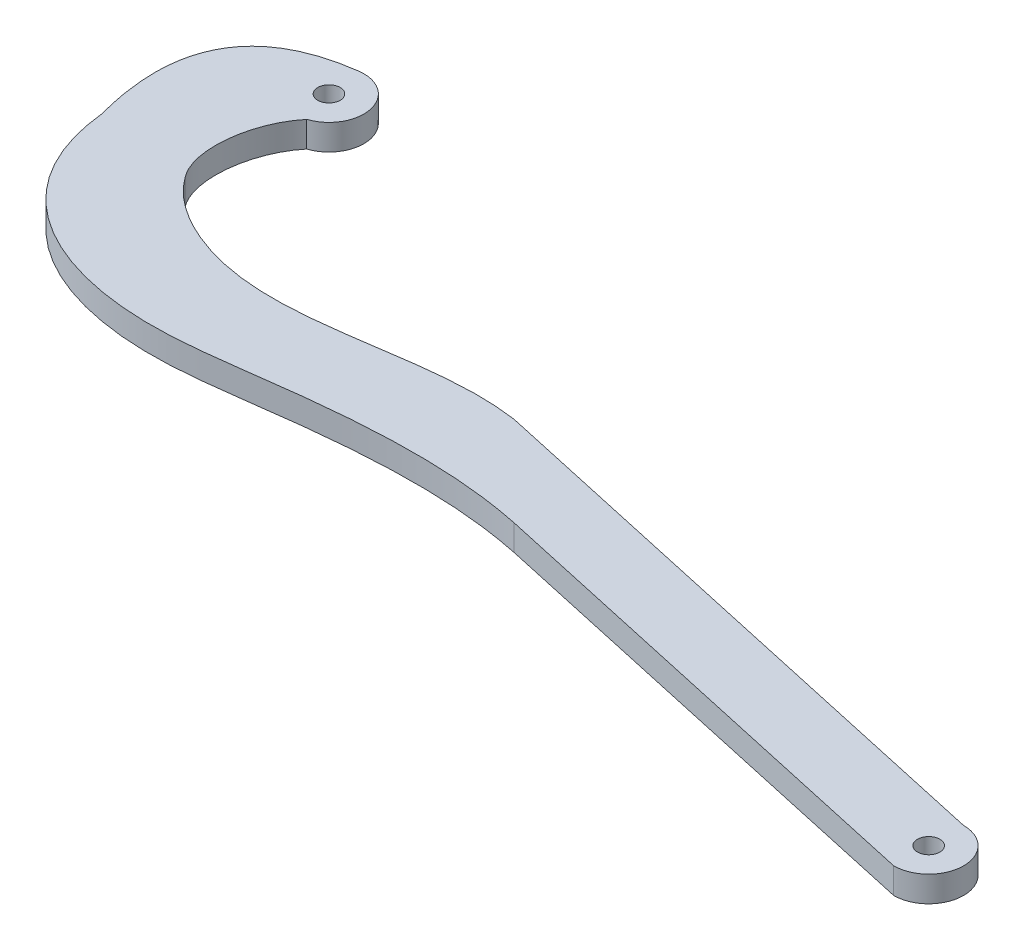
ISO-10303-21;
HEADER;
FILE_DESCRIPTION(('STEP AP214'),'2;1');
FILE_NAME('part.step','',(''),(''),'','','');
FILE_SCHEMA(('AUTOMOTIVE_DESIGN { 1 0 10303 214 1 1 1 1 }'));
ENDSEC;
DATA;
#1=APPLICATION_CONTEXT('core data for automotive mechanical design processes');
#2=APPLICATION_PROTOCOL_DEFINITION('international standard','automotive_design',2000,#1);
#3=PRODUCT_CONTEXT('',#1,'mechanical');
#4=PRODUCT('Part','Part','',(#3));
#5=PRODUCT_RELATED_PRODUCT_CATEGORY('part','',(#4));
#6=PRODUCT_DEFINITION_FORMATION('','',#4);
#7=PRODUCT_DEFINITION_CONTEXT('part definition',#1,'design');
#8=PRODUCT_DEFINITION('design','',#6,#7);
#9=PRODUCT_DEFINITION_SHAPE('','',#8);
#10=(LENGTH_UNIT() NAMED_UNIT(*) SI_UNIT(.MILLI.,.METRE.));
#11=(NAMED_UNIT(*) PLANE_ANGLE_UNIT() SI_UNIT($,.RADIAN.));
#12=(NAMED_UNIT(*) SI_UNIT($,.STERADIAN.) SOLID_ANGLE_UNIT());
#13=UNCERTAINTY_MEASURE_WITH_UNIT(LENGTH_MEASURE(1.E-05),#10,'distance_accuracy_value','');
#14=(GEOMETRIC_REPRESENTATION_CONTEXT(3) GLOBAL_UNCERTAINTY_ASSIGNED_CONTEXT((#13)) GLOBAL_UNIT_ASSIGNED_CONTEXT((#10,
#11,#12)) REPRESENTATION_CONTEXT('',''));
#15=CARTESIAN_POINT('',(0.,0.,0.));
#16=DIRECTION('',(0.,0.,1.));
#17=DIRECTION('',(1.,0.,0.));
#18=AXIS2_PLACEMENT_3D('',#15,#16,#17);
#19=CARTESIAN_POINT('',(0.,5.842,0.));
#20=DIRECTION('',(0.,-1.,0.));
#21=DIRECTION('',(0.,0.,-1.));
#22=AXIS2_PLACEMENT_3D('',#19,#20,#21);
#23=CYLINDRICAL_SURFACE('',#22,7.9375);
#24=CARTESIAN_POINT('',(0.,0.,0.));
#25=DIRECTION('',(0.,1.,0.));
#26=DIRECTION('',(0.,0.,1.));
#27=AXIS2_PLACEMENT_3D('',#24,#25,#26);
#28=CIRCLE('',#27,7.9375);
#29=CARTESIAN_POINT('',(2.49064355468781,0.,7.53661734025896));
#30=VERTEX_POINT('',#29);
#31=CARTESIAN_POINT('',(-0.961636053544628,0.,-7.87903308474606));
#32=VERTEX_POINT('',#31);
#33=EDGE_CURVE('E205',#30,#32,#28,.T.);
#34=ORIENTED_EDGE('',*,*,#33,.T.);
#35=DIRECTION('',(0.,-1.,0.));
#36=VECTOR('',#35,1.);
#37=CARTESIAN_POINT('',(-0.961636053544628,5.842,-7.87903308474606));
#38=LINE('',#37,#36);
#39=CARTESIAN_POINT('',(-0.961636053544628,5.842,-7.87903308474606));
#40=VERTEX_POINT('',#39);
#41=EDGE_CURVE('E11',#40,#32,#38,.T.);
#42=ORIENTED_EDGE('',*,*,#41,.F.);
#43=CARTESIAN_POINT('',(0.,5.842,0.));
#44=DIRECTION('',(0.,1.,0.));
#45=DIRECTION('',(0.,0.,1.));
#46=AXIS2_PLACEMENT_3D('',#43,#44,#45);
#47=CIRCLE('',#46,7.9375);
#48=CARTESIAN_POINT('',(2.49064355468781,5.842,7.53661734025896));
#49=VERTEX_POINT('',#48);
#50=EDGE_CURVE('E239',#49,#40,#47,.T.);
#51=ORIENTED_EDGE('',*,*,#50,.F.);
#52=DIRECTION('',(0.,-1.,0.));
#53=VECTOR('',#52,1.);
#54=CARTESIAN_POINT('',(2.49064355468781,5.842,7.53661734025896));
#55=LINE('',#54,#53);
#56=EDGE_CURVE('E52',#49,#30,#55,.T.);
#57=ORIENTED_EDGE('',*,*,#56,.T.);
#58=EDGE_LOOP('',(#34,#42,#51,#57));
#59=FACE_BOUND('',#58,.T.);
#60=ADVANCED_FACE('F36',(#59),#23,.T.);
#61=CARTESIAN_POINT('',(-0.96163605354463,5.842,-7.87903308474607));
#62=CARTESIAN_POINT('',(-30.9985165462745,5.842,-4.01650988273508));
#63=CARTESIAN_POINT('',(-21.8783564093828,5.842,29.6751276414794));
#64=B_SPLINE_CURVE_WITH_KNOTS('',2,(#61,#62,#63),.UNSPECIFIED.,.F.,.F.,(3,3),(0.,
0.35527502732888),.UNSPECIFIED.);
#65=DIRECTION('',(0.,-1.,0.));
#66=VECTOR('',#65,1.);
#67=SURFACE_OF_LINEAR_EXTRUSION('',#64,#66);
#68=CARTESIAN_POINT('',(-0.96163605354463,0.,-7.87903308474607));
#69=CARTESIAN_POINT('',(-30.9985165462745,0.,-4.01650988273508));
#70=CARTESIAN_POINT('',(-21.8783564093828,0.,29.6751276414794));
#71=B_SPLINE_CURVE_WITH_KNOTS('',2,(#68,#69,#70),.UNSPECIFIED.,.F.,.F.,(3,3),(0.,
0.35527502732888),.UNSPECIFIED.);
#72=CARTESIAN_POINT('',(-21.8783564093828,0.,29.6751276414794));
#73=VERTEX_POINT('',#72);
#74=EDGE_CURVE('E202',#32,#73,#71,.T.);
#75=ORIENTED_EDGE('',*,*,#74,.T.);
#76=DIRECTION('',(0.,-1.,0.));
#77=VECTOR('',#76,1.);
#78=CARTESIAN_POINT('',(-21.8783564093828,5.842,29.6751276414794));
#79=LINE('',#78,#77);
#80=CARTESIAN_POINT('',(-21.8783564093828,5.842,29.6751276414794));
#81=VERTEX_POINT('',#80);
#82=EDGE_CURVE('E44',#81,#73,#79,.T.);
#83=ORIENTED_EDGE('',*,*,#82,.F.);
#84=EDGE_CURVE('E90',#40,#81,#64,.T.);
#85=ORIENTED_EDGE('',*,*,#84,.F.);
#86=ORIENTED_EDGE('',*,*,#41,.T.);
#87=EDGE_LOOP('',(#75,#83,#85,#86));
#88=FACE_BOUND('',#87,.T.);
#89=ADVANCED_FACE('F164',(#88),#67,.F.);
#90=CARTESIAN_POINT('',(-21.8783564093828,5.842,29.6751276414794));
#91=CARTESIAN_POINT('',(-19.1757089829597,5.842,55.8612041472436));
#92=CARTESIAN_POINT('',(11.6989839676944,5.842,69.0974176284351));
#93=CARTESIAN_POINT('',(59.1950530478991,5.842,61.6130832527183));
#94=CARTESIAN_POINT('',(86.7060869899994,5.842,59.4299802769365));
#95=CARTESIAN_POINT('',(105.423206443273,5.842,63.3548489846126));
#96=B_SPLINE_CURVE_WITH_KNOTS('',3,(#90,#91,#92,#93,#94,#95),.UNSPECIFIED.,.F.,.F.,(4,1,1,4),
(0.,0.428303152813211,0.609288088126055,1.),.UNSPECIFIED.);
#97=DIRECTION('',(0.,-1.,0.));
#98=VECTOR('',#97,1.);
#99=SURFACE_OF_LINEAR_EXTRUSION('',#96,#98);
#100=CARTESIAN_POINT('',(-21.8783564093828,0.,29.6751276414794));
#101=CARTESIAN_POINT('',(-19.1757089829597,0.,55.8612041472436));
#102=CARTESIAN_POINT('',(11.6989839676944,0.,69.0974176284351));
#103=CARTESIAN_POINT('',(59.1950530478991,0.,61.6130832527183));
#104=CARTESIAN_POINT('',(86.7060869899994,0.,59.4299802769365));
#105=CARTESIAN_POINT('',(105.423206443273,0.,63.3548489846126));
#106=B_SPLINE_CURVE_WITH_KNOTS('',3,(#100,#101,#102,#103,#104,#105),.UNSPECIFIED.,.F.,.F.,(4,1,
1,4),(0.,0.428303152813211,0.609288088126055,1.),.UNSPECIFIED.);
#107=CARTESIAN_POINT('',(105.423206443273,0.,63.3548489846126));
#108=VERTEX_POINT('',#107);
#109=EDGE_CURVE('E198',#73,#108,#106,.T.);
#110=ORIENTED_EDGE('',*,*,#109,.T.);
#111=DIRECTION('',(0.,-1.,0.));
#112=VECTOR('',#111,1.);
#113=CARTESIAN_POINT('',(105.423206443273,5.842,63.3548489846126));
#114=LINE('',#113,#112);
#115=CARTESIAN_POINT('',(105.423206443273,5.842,63.3548489846126));
#116=VERTEX_POINT('',#115);
#117=EDGE_CURVE('E190',#116,#108,#114,.T.);
#118=ORIENTED_EDGE('',*,*,#117,.F.);
#119=EDGE_CURVE('E167',#81,#116,#96,.T.);
#120=ORIENTED_EDGE('',*,*,#119,.F.);
#121=ORIENTED_EDGE('',*,*,#82,.T.);
#122=EDGE_LOOP('',(#110,#118,#120,#121));
#123=FACE_BOUND('',#122,.T.);
#124=ADVANCED_FACE('F160',(#123),#99,.F.);
#125=CARTESIAN_POINT('',(-8.43114589308616,5.842,38.2756490531321));
#126=DIRECTION('',(0.215117386265898,0.,-0.976588198846437));
#127=DIRECTION('',(-0.976588198846437,0.,-0.215117386265898));
#128=AXIS2_PLACEMENT_3D('',#125,#126,#127);
#129=PLANE('',#128);
#130=DIRECTION('',(0.976588198846437,0.,0.215117386265898));
#131=VECTOR('',#130,1.);
#132=CARTESIAN_POINT('',(-8.43114589308616,0.,38.2756490531321));
#133=LINE('',#132,#131);
#134=CARTESIAN_POINT('',(216.015488733557,0.,87.7154983714961));
#135=VERTEX_POINT('',#134);
#136=EDGE_CURVE('E188',#108,#135,#133,.T.);
#137=ORIENTED_EDGE('',*,*,#136,.T.);
#138=DIRECTION('',(0.,-1.,0.));
#139=VECTOR('',#138,1.);
#140=CARTESIAN_POINT('',(216.015488733557,5.842,87.7154983714961));
#141=LINE('',#140,#139);
#142=CARTESIAN_POINT('',(216.015488733557,5.842,87.7154983714961));
#143=VERTEX_POINT('',#142);
#144=EDGE_CURVE('E186',#143,#135,#141,.T.);
#145=ORIENTED_EDGE('',*,*,#144,.F.);
#146=DIRECTION('',(0.976588198846437,0.,0.215117386265898));
#147=VECTOR('',#146,1.);
#148=CARTESIAN_POINT('',(-8.43114589308616,5.842,38.2756490531321));
#149=LINE('',#148,#147);
#150=EDGE_CURVE('E172',#116,#143,#149,.T.);
#151=ORIENTED_EDGE('',*,*,#150,.F.);
#152=ORIENTED_EDGE('',*,*,#117,.T.);
#153=EDGE_LOOP('',(#137,#145,#151,#152));
#154=FACE_BOUND('',#153,.T.);
#155=ADVANCED_FACE('F156',(#154),#129,.F.);
#156=CARTESIAN_POINT('',(216.015488733557,5.842,79.7779983714962));
#157=DIRECTION('',(0.,-1.,0.));
#158=DIRECTION('',(0.,0.,-1.));
#159=AXIS2_PLACEMENT_3D('',#156,#157,#158);
#160=CYLINDRICAL_SURFACE('',#159,7.93750000000048);
#161=CARTESIAN_POINT('',(216.015488733557,0.,79.7779983714962));
#162=DIRECTION('',(0.,1.,0.));
#163=DIRECTION('',(0.,0.,1.));
#164=AXIS2_PLACEMENT_3D('',#161,#162,#163);
#165=CIRCLE('',#164,7.93750000000048);
#166=CARTESIAN_POINT('',(216.015488733557,0.,71.8404983714962));
#167=VERTEX_POINT('',#166);
#168=EDGE_CURVE('E192',#135,#167,#165,.T.);
#169=ORIENTED_EDGE('',*,*,#168,.T.);
#170=DIRECTION('',(0.,-1.,0.));
#171=VECTOR('',#170,1.);
#172=CARTESIAN_POINT('',(216.015488733557,5.842,71.8404983714962));
#173=LINE('',#172,#171);
#174=CARTESIAN_POINT('',(216.015488733557,5.842,71.8404983714962));
#175=VERTEX_POINT('',#174);
#176=EDGE_CURVE('E126',#175,#167,#173,.T.);
#177=ORIENTED_EDGE('',*,*,#176,.F.);
#178=CARTESIAN_POINT('',(216.015488733557,5.842,79.7779983714962));
#179=DIRECTION('',(0.,1.,0.));
#180=DIRECTION('',(0.,0.,1.));
#181=AXIS2_PLACEMENT_3D('',#178,#179,#180);
#182=CIRCLE('',#181,7.93750000000048);
#183=EDGE_CURVE('E114',#143,#175,#182,.T.);
#184=ORIENTED_EDGE('',*,*,#183,.F.);
#185=ORIENTED_EDGE('',*,*,#144,.T.);
#186=EDGE_LOOP('',(#169,#177,#184,#185));
#187=FACE_BOUND('',#186,.T.);
#188=ADVANCED_FACE('F153',(#187),#160,.T.);
#189=CARTESIAN_POINT('',(-5.09610841798199,5.842,23.1352724548801));
#190=DIRECTION('',(-0.215117386265896,0.,0.976588198846438));
#191=DIRECTION('',(0.976588198846438,0.,0.215117386265896));
#192=AXIS2_PLACEMENT_3D('',#189,#190,#191);
#193=PLANE('',#192);
#194=DIRECTION('',(-0.976588198846438,0.,-0.215117386265896));
#195=VECTOR('',#194,1.);
#196=CARTESIAN_POINT('',(-5.09610841798199,0.,23.1352724548801));
#197=LINE('',#196,#195);
#198=CARTESIAN_POINT('',(84.9851429914654,0.,42.9778666800111));
#199=VERTEX_POINT('',#198);
#200=EDGE_CURVE('E123',#167,#199,#197,.T.);
#201=ORIENTED_EDGE('',*,*,#200,.T.);
#202=DIRECTION('',(0.,-1.,0.));
#203=VECTOR('',#202,1.);
#204=CARTESIAN_POINT('',(84.9851429914654,5.842,42.9778666800111));
#205=LINE('',#204,#203);
#206=CARTESIAN_POINT('',(84.9851429914654,5.842,42.9778666800111));
#207=VERTEX_POINT('',#206);
#208=EDGE_CURVE('E120',#207,#199,#205,.T.);
#209=ORIENTED_EDGE('',*,*,#208,.F.);
#210=DIRECTION('',(-0.976588198846438,0.,-0.215117386265896));
#211=VECTOR('',#210,1.);
#212=CARTESIAN_POINT('',(-5.09610841798199,5.842,23.1352724548801));
#213=LINE('',#212,#211);
#214=EDGE_CURVE('E106',#175,#207,#213,.T.);
#215=ORIENTED_EDGE('',*,*,#214,.F.);
#216=ORIENTED_EDGE('',*,*,#176,.T.);
#217=EDGE_LOOP('',(#201,#209,#215,#216));
#218=FACE_BOUND('',#217,.T.);
#219=ADVANCED_FACE('F121',(#218),#193,.F.);
#220=CARTESIAN_POINT('',(-1.12625635587275,5.842,30.819140757582));
#221=CARTESIAN_POINT('',(-0.75999004990736,5.842,31.4894180186553));
#222=CARTESIAN_POINT('',(3.46938920269424,5.842,38.2196515050886));
#223=CARTESIAN_POINT('',(33.5487694134597,5.842,54.5348101577285));
#224=CARTESIAN_POINT('',(63.1910466168296,5.842,39.7727750031689));
#225=CARTESIAN_POINT('',(84.9851429914654,5.842,42.9778666800111));
#226=B_SPLINE_CURVE_WITH_KNOTS('',3,(#220,#221,#222,#223,#224,#225),.UNSPECIFIED.,.F.,.F.,(4,1,
1,4),(0.174415631372759,0.196438425142151,0.402512938325981,1.),.UNSPECIFIED.);
#227=DIRECTION('',(0.,-1.,0.));
#228=VECTOR('',#227,1.);
#229=SURFACE_OF_LINEAR_EXTRUSION('',#226,#228);
#230=CARTESIAN_POINT('',(-1.12625635587275,0.,30.819140757582));
#231=CARTESIAN_POINT('',(-0.75999004990736,0.,31.4894180186553));
#232=CARTESIAN_POINT('',(3.46938920269424,0.,38.2196515050886));
#233=CARTESIAN_POINT('',(33.5487694134597,0.,54.5348101577285));
#234=CARTESIAN_POINT('',(63.1910466168296,0.,39.7727750031689));
#235=CARTESIAN_POINT('',(84.9851429914654,0.,42.9778666800111));
#236=B_SPLINE_CURVE_WITH_KNOTS('',3,(#230,#231,#232,#233,#234,#235),.UNSPECIFIED.,.F.,.F.,(4,1,
1,4),(0.174415631372759,0.196438425142151,0.402512938325981,1.),.UNSPECIFIED.);
#237=CARTESIAN_POINT('',(0.0947469177934702,0.,32.7683073072071));
#238=VERTEX_POINT('',#237);
#239=EDGE_CURVE('E218',#238,#199,#236,.T.);
#240=ORIENTED_EDGE('',*,*,#239,.F.);
#241=DIRECTION('',(0.,-1.,0.));
#242=VECTOR('',#241,1.);
#243=CARTESIAN_POINT('',(0.0947469177934702,5.842,32.7683073072071));
#244=LINE('',#243,#242);
#245=CARTESIAN_POINT('',(0.0947469177934702,5.842,32.7683073072071));
#246=VERTEX_POINT('',#245);
#247=EDGE_CURVE('E78',#246,#238,#244,.T.);
#248=ORIENTED_EDGE('',*,*,#247,.F.);
#249=EDGE_CURVE('E112',#246,#207,#226,.T.);
#250=ORIENTED_EDGE('',*,*,#249,.T.);
#251=ORIENTED_EDGE('',*,*,#208,.T.);
#252=EDGE_LOOP('',(#240,#248,#250,#251));
#253=FACE_BOUND('',#252,.T.);
#254=ADVANCED_FACE('F128',(#253),#229,.T.);
#255=CARTESIAN_POINT('',(216.015488733557,5.842,79.7779983714962));
#256=DIRECTION('',(0.,-1.,0.));
#257=DIRECTION('',(0.,0.,-1.));
#258=AXIS2_PLACEMENT_3D('',#255,#256,#257);
#259=CYLINDRICAL_SURFACE('',#258,2.53999999999998);
#260=CARTESIAN_POINT('',(216.015488733557,5.842,79.7779983714962));
#261=DIRECTION('',(0.,1.,0.));
#262=DIRECTION('',(0.,0.,1.));
#263=AXIS2_PLACEMENT_3D('',#260,#261,#262);
#264=CIRCLE('',#263,2.53999999999998);
#265=CARTESIAN_POINT('',(216.015488733557,5.842,82.3179983714961));
#266=VERTEX_POINT('',#265);
#267=EDGE_CURVE('E131',#266,#266,#264,.T.);
#268=ORIENTED_EDGE('',*,*,#267,.T.);
#269=EDGE_LOOP('',(#268));
#270=FACE_BOUND('',#269,.T.);
#271=CARTESIAN_POINT('',(216.015488733557,0.,79.7779983714962));
#272=DIRECTION('',(0.,1.,0.));
#273=DIRECTION('',(0.,0.,1.));
#274=AXIS2_PLACEMENT_3D('',#271,#272,#273);
#275=CIRCLE('',#274,2.53999999999998);
#276=CARTESIAN_POINT('',(216.015488733557,0.,82.3179983714961));
#277=VERTEX_POINT('',#276);
#278=EDGE_CURVE('E230',#277,#277,#275,.T.);
#279=ORIENTED_EDGE('',*,*,#278,.F.);
#280=EDGE_LOOP('',(#279));
#281=FACE_BOUND('',#280,.T.);
#282=ADVANCED_FACE('F148',(#270,#281),#259,.F.);
#283=CARTESIAN_POINT('',(2.49064355468781,5.842,7.53661734025896));
#284=CARTESIAN_POINT('',(-3.17706225179502,5.842,14.2700257039123));
#285=CARTESIAN_POINT('',(-4.68277437856466,5.842,26.6902659635083));
#286=CARTESIAN_POINT('',(0.0947469200730601,5.842,32.7683073104197));
#287=B_SPLINE_CURVE_WITH_KNOTS('',3,(#283,#284,#285,#286),.UNSPECIFIED.,.F.,.F.,(4,4),
(0.069847551269925,0.385912124834695),.UNSPECIFIED.);
#288=DIRECTION('',(0.,-1.,0.));
#289=VECTOR('',#288,1.);
#290=SURFACE_OF_LINEAR_EXTRUSION('',#287,#289);
#291=CARTESIAN_POINT('',(2.49064355468781,0.,7.53661734025896));
#292=CARTESIAN_POINT('',(-3.17706225179502,0.,14.2700257039123));
#293=CARTESIAN_POINT('',(-4.68277437856466,0.,26.6902659635083));
#294=CARTESIAN_POINT('',(0.0947469200730601,0.,32.7683073104197));
#295=B_SPLINE_CURVE_WITH_KNOTS('',3,(#291,#292,#293,#294),.UNSPECIFIED.,.F.,.F.,(4,4),
(0.069847551269925,0.385912124834695),.UNSPECIFIED.);
#296=EDGE_CURVE('E222',#30,#238,#295,.T.);
#297=ORIENTED_EDGE('',*,*,#296,.F.);
#298=ORIENTED_EDGE('',*,*,#56,.F.);
#299=EDGE_CURVE('E129',#49,#246,#287,.T.);
#300=ORIENTED_EDGE('',*,*,#299,.T.);
#301=ORIENTED_EDGE('',*,*,#247,.T.);
#302=EDGE_LOOP('',(#297,#298,#300,#301));
#303=FACE_BOUND('',#302,.T.);
#304=ADVANCED_FACE('F149',(#303),#290,.T.);
#305=CARTESIAN_POINT('',(0.,5.842,0.));
#306=DIRECTION('',(0.,-1.,0.));
#307=DIRECTION('',(0.,0.,-1.));
#308=AXIS2_PLACEMENT_3D('',#305,#306,#307);
#309=CYLINDRICAL_SURFACE('',#308,2.54);
#310=CARTESIAN_POINT('',(0.,5.842,0.));
#311=DIRECTION('',(0.,1.,0.));
#312=DIRECTION('',(0.,0.,1.));
#313=AXIS2_PLACEMENT_3D('',#310,#311,#312);
#314=CIRCLE('',#313,2.54);
#315=CARTESIAN_POINT('',(0.,5.842,2.54));
#316=VERTEX_POINT('',#315);
#317=EDGE_CURVE('E240',#316,#316,#314,.T.);
#318=ORIENTED_EDGE('',*,*,#317,.T.);
#319=EDGE_LOOP('',(#318));
#320=FACE_BOUND('',#319,.T.);
#321=CARTESIAN_POINT('',(0.,0.,0.));
#322=DIRECTION('',(0.,1.,0.));
#323=DIRECTION('',(0.,0.,1.));
#324=AXIS2_PLACEMENT_3D('',#321,#322,#323);
#325=CIRCLE('',#324,2.54);
#326=CARTESIAN_POINT('',(0.,0.,2.54));
#327=VERTEX_POINT('',#326);
#328=EDGE_CURVE('E236',#327,#327,#325,.T.);
#329=ORIENTED_EDGE('',*,*,#328,.F.);
#330=EDGE_LOOP('',(#329));
#331=FACE_BOUND('',#330,.T.);
#332=ADVANCED_FACE('F248',(#320,#331),#309,.F.);
#333=CARTESIAN_POINT('',(0.,5.842,0.));
#334=DIRECTION('',(0.,1.,0.));
#335=DIRECTION('',(0.,0.,1.));
#336=AXIS2_PLACEMENT_3D('',#333,#334,#335);
#337=PLANE('',#336);
#338=ORIENTED_EDGE('',*,*,#50,.T.);
#339=ORIENTED_EDGE('',*,*,#84,.T.);
#340=ORIENTED_EDGE('',*,*,#119,.T.);
#341=ORIENTED_EDGE('',*,*,#150,.T.);
#342=ORIENTED_EDGE('',*,*,#183,.T.);
#343=ORIENTED_EDGE('',*,*,#214,.T.);
#344=ORIENTED_EDGE('',*,*,#249,.F.);
#345=ORIENTED_EDGE('',*,*,#299,.F.);
#346=EDGE_LOOP('',(#338,#339,#340,#341,#342,#343,#344,#345));
#347=FACE_BOUND('',#346,.T.);
#348=ORIENTED_EDGE('',*,*,#267,.F.);
#349=EDGE_LOOP('',(#348));
#350=FACE_BOUND('',#349,.T.);
#351=ORIENTED_EDGE('',*,*,#317,.F.);
#352=EDGE_LOOP('',(#351));
#353=FACE_BOUND('',#352,.T.);
#354=ADVANCED_FACE('F108',(#347,#350,#353),#337,.T.);
#355=CARTESIAN_POINT('',(0.,0.,0.));
#356=DIRECTION('',(0.,1.,0.));
#357=DIRECTION('',(0.,0.,1.));
#358=AXIS2_PLACEMENT_3D('',#355,#356,#357);
#359=PLANE('',#358);
#360=ORIENTED_EDGE('',*,*,#33,.F.);
#361=ORIENTED_EDGE('',*,*,#296,.T.);
#362=ORIENTED_EDGE('',*,*,#239,.T.);
#363=ORIENTED_EDGE('',*,*,#200,.F.);
#364=ORIENTED_EDGE('',*,*,#168,.F.);
#365=ORIENTED_EDGE('',*,*,#136,.F.);
#366=ORIENTED_EDGE('',*,*,#109,.F.);
#367=ORIENTED_EDGE('',*,*,#74,.F.);
#368=EDGE_LOOP('',(#360,#361,#362,#363,#364,#365,#366,#367));
#369=FACE_BOUND('',#368,.T.);
#370=ORIENTED_EDGE('',*,*,#278,.T.);
#371=EDGE_LOOP('',(#370));
#372=FACE_BOUND('',#371,.T.);
#373=ORIENTED_EDGE('',*,*,#328,.T.);
#374=EDGE_LOOP('',(#373));
#375=FACE_BOUND('',#374,.T.);
#376=ADVANCED_FACE('F200',(#369,#372,#375),#359,.F.);
#377=CLOSED_SHELL('',(#60,#89,#124,#155,#188,#219,#254,#282,#304,#332,#354,#376));
#378=MANIFOLD_SOLID_BREP('B2',#377);
#379=ADVANCED_BREP_SHAPE_REPRESENTATION('',(#18,#378),#14);
#380=SHAPE_DEFINITION_REPRESENTATION(#9,#379);
ENDSEC;
END-ISO-10303-21;
